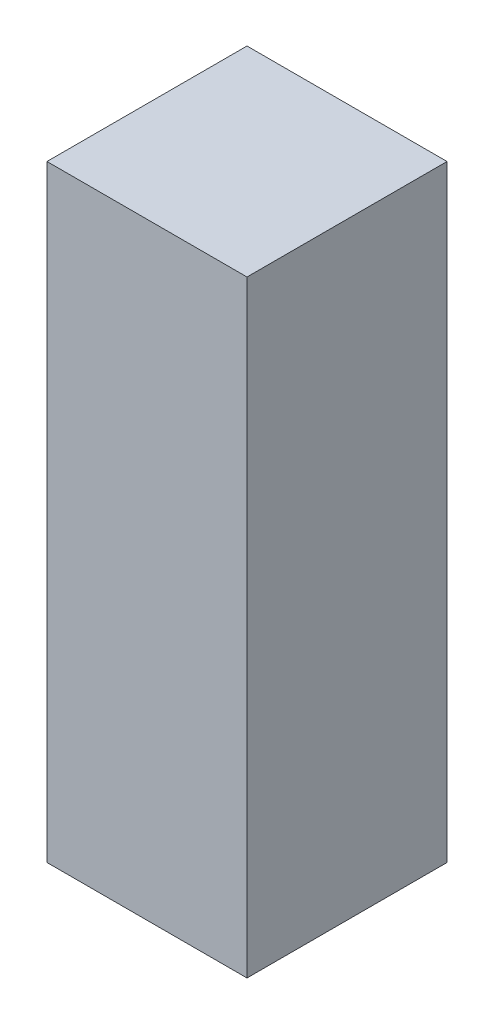
ISO-10303-21;
HEADER;
FILE_DESCRIPTION(('STEP AP214'),'2;1');
FILE_NAME('part.step','',(''),(''),'','','');
FILE_SCHEMA(('AUTOMOTIVE_DESIGN { 1 0 10303 214 1 1 1 1 }'));
ENDSEC;
DATA;
#1=APPLICATION_CONTEXT('core data for automotive mechanical design processes');
#2=APPLICATION_PROTOCOL_DEFINITION('international standard','automotive_design',2000,#1);
#3=PRODUCT_CONTEXT('',#1,'mechanical');
#4=PRODUCT('Part','Part','',(#3));
#5=PRODUCT_RELATED_PRODUCT_CATEGORY('part','',(#4));
#6=PRODUCT_DEFINITION_FORMATION('','',#4);
#7=PRODUCT_DEFINITION_CONTEXT('part definition',#1,'design');
#8=PRODUCT_DEFINITION('design','',#6,#7);
#9=PRODUCT_DEFINITION_SHAPE('','',#8);
#10=(LENGTH_UNIT() NAMED_UNIT(*) SI_UNIT(.MILLI.,.METRE.));
#11=(NAMED_UNIT(*) PLANE_ANGLE_UNIT() SI_UNIT($,.RADIAN.));
#12=(NAMED_UNIT(*) SI_UNIT($,.STERADIAN.) SOLID_ANGLE_UNIT());
#13=UNCERTAINTY_MEASURE_WITH_UNIT(LENGTH_MEASURE(1.E-05),#10,'distance_accuracy_value','');
#14=(GEOMETRIC_REPRESENTATION_CONTEXT(3) GLOBAL_UNCERTAINTY_ASSIGNED_CONTEXT((#13)) GLOBAL_UNIT_ASSIGNED_CONTEXT((#10,
#11,#12)) REPRESENTATION_CONTEXT('',''));
#15=CARTESIAN_POINT('',(0.,0.,0.));
#16=DIRECTION('',(0.,0.,1.));
#17=DIRECTION('',(1.,0.,0.));
#18=AXIS2_PLACEMENT_3D('',#15,#16,#17);
#19=CARTESIAN_POINT('',(50.,303.5,50.));
#20=DIRECTION('',(-1.,0.,0.));
#21=DIRECTION('',(0.,0.,1.));
#22=AXIS2_PLACEMENT_3D('',#19,#20,#21);
#23=PLANE('',#22);
#24=DIRECTION('',(0.,0.,-1.));
#25=VECTOR('',#24,1.);
#26=CARTESIAN_POINT('',(50.,0.,50.));
#27=LINE('',#26,#25);
#28=CARTESIAN_POINT('',(50.,0.,50.));
#29=VERTEX_POINT('',#28);
#30=CARTESIAN_POINT('',(50.,0.,-50.));
#31=VERTEX_POINT('',#30);
#32=EDGE_CURVE('E107',#29,#31,#27,.T.);
#33=ORIENTED_EDGE('',*,*,#32,.T.);
#34=DIRECTION('',(0.,-1.,0.));
#35=VECTOR('',#34,1.);
#36=CARTESIAN_POINT('',(50.,303.5,-50.));
#37=LINE('',#36,#35);
#38=CARTESIAN_POINT('',(50.,303.5,-50.));
#39=VERTEX_POINT('',#38);
#40=EDGE_CURVE('E11',#39,#31,#37,.T.);
#41=ORIENTED_EDGE('',*,*,#40,.F.);
#42=DIRECTION('',(0.,0.,-1.));
#43=VECTOR('',#42,1.);
#44=CARTESIAN_POINT('',(50.,303.5,50.));
#45=LINE('',#44,#43);
#46=CARTESIAN_POINT('',(50.,303.5,50.));
#47=VERTEX_POINT('',#46);
#48=EDGE_CURVE('E91',#47,#39,#45,.T.);
#49=ORIENTED_EDGE('',*,*,#48,.F.);
#50=DIRECTION('',(0.,-1.,0.));
#51=VECTOR('',#50,1.);
#52=CARTESIAN_POINT('',(50.,303.5,50.));
#53=LINE('',#52,#51);
#54=EDGE_CURVE('E103',#47,#29,#53,.T.);
#55=ORIENTED_EDGE('',*,*,#54,.T.);
#56=EDGE_LOOP('',(#33,#41,#49,#55));
#57=FACE_BOUND('',#56,.T.);
#58=ADVANCED_FACE('F39',(#57),#23,.F.);
#59=CARTESIAN_POINT('',(-50.,303.5,-50.));
#60=DIRECTION('',(0.,0.,1.));
#61=DIRECTION('',(1.,0.,0.));
#62=AXIS2_PLACEMENT_3D('',#59,#60,#61);
#63=PLANE('',#62);
#64=DIRECTION('',(-1.,0.,0.));
#65=VECTOR('',#64,1.);
#66=CARTESIAN_POINT('',(-50.,0.,-50.));
#67=LINE('',#66,#65);
#68=CARTESIAN_POINT('',(-50.,0.,-50.));
#69=VERTEX_POINT('',#68);
#70=EDGE_CURVE('E96',#31,#69,#67,.T.);
#71=ORIENTED_EDGE('',*,*,#70,.T.);
#72=DIRECTION('',(0.,-1.,0.));
#73=VECTOR('',#72,1.);
#74=CARTESIAN_POINT('',(-50.,303.5,-50.));
#75=LINE('',#74,#73);
#76=CARTESIAN_POINT('',(-50.,303.5,-50.));
#77=VERTEX_POINT('',#76);
#78=EDGE_CURVE('E48',#77,#69,#75,.T.);
#79=ORIENTED_EDGE('',*,*,#78,.F.);
#80=DIRECTION('',(-1.,0.,0.));
#81=VECTOR('',#80,1.);
#82=CARTESIAN_POINT('',(-50.,303.5,-50.));
#83=LINE('',#82,#81);
#84=EDGE_CURVE('E86',#39,#77,#83,.T.);
#85=ORIENTED_EDGE('',*,*,#84,.F.);
#86=ORIENTED_EDGE('',*,*,#40,.T.);
#87=EDGE_LOOP('',(#71,#79,#85,#86));
#88=FACE_BOUND('',#87,.T.);
#89=ADVANCED_FACE('F95',(#88),#63,.F.);
#90=CARTESIAN_POINT('',(-50.,303.5,50.));
#91=DIRECTION('',(1.,0.,0.));
#92=DIRECTION('',(0.,0.,-1.));
#93=AXIS2_PLACEMENT_3D('',#90,#91,#92);
#94=PLANE('',#93);
#95=DIRECTION('',(0.,0.,1.));
#96=VECTOR('',#95,1.);
#97=CARTESIAN_POINT('',(-50.,0.,50.));
#98=LINE('',#97,#96);
#99=CARTESIAN_POINT('',(-50.,0.,50.));
#100=VERTEX_POINT('',#99);
#101=EDGE_CURVE('E73',#69,#100,#98,.T.);
#102=ORIENTED_EDGE('',*,*,#101,.T.);
#103=DIRECTION('',(0.,-1.,0.));
#104=VECTOR('',#103,1.);
#105=CARTESIAN_POINT('',(-50.,303.5,50.));
#106=LINE('',#105,#104);
#107=CARTESIAN_POINT('',(-50.,303.5,50.));
#108=VERTEX_POINT('',#107);
#109=EDGE_CURVE('E98',#108,#100,#106,.T.);
#110=ORIENTED_EDGE('',*,*,#109,.F.);
#111=DIRECTION('',(0.,0.,1.));
#112=VECTOR('',#111,1.);
#113=CARTESIAN_POINT('',(-50.,303.5,50.));
#114=LINE('',#113,#112);
#115=EDGE_CURVE('E89',#77,#108,#114,.T.);
#116=ORIENTED_EDGE('',*,*,#115,.F.);
#117=ORIENTED_EDGE('',*,*,#78,.T.);
#118=EDGE_LOOP('',(#102,#110,#116,#117));
#119=FACE_BOUND('',#118,.T.);
#120=ADVANCED_FACE('F99',(#119),#94,.F.);
#121=CARTESIAN_POINT('',(-50.,303.5,50.));
#122=DIRECTION('',(0.,0.,-1.));
#123=DIRECTION('',(-1.,0.,0.));
#124=AXIS2_PLACEMENT_3D('',#121,#122,#123);
#125=PLANE('',#124);
#126=DIRECTION('',(1.,0.,0.));
#127=VECTOR('',#126,1.);
#128=CARTESIAN_POINT('',(-50.,0.,50.));
#129=LINE('',#128,#127);
#130=EDGE_CURVE('E79',#100,#29,#129,.T.);
#131=ORIENTED_EDGE('',*,*,#130,.T.);
#132=ORIENTED_EDGE('',*,*,#54,.F.);
#133=DIRECTION('',(1.,0.,0.));
#134=VECTOR('',#133,1.);
#135=CARTESIAN_POINT('',(-50.,303.5,50.));
#136=LINE('',#135,#134);
#137=EDGE_CURVE('E56',#108,#47,#136,.T.);
#138=ORIENTED_EDGE('',*,*,#137,.F.);
#139=ORIENTED_EDGE('',*,*,#109,.T.);
#140=EDGE_LOOP('',(#131,#132,#138,#139));
#141=FACE_BOUND('',#140,.T.);
#142=ADVANCED_FACE('F120',(#141),#125,.F.);
#143=CARTESIAN_POINT('',(0.,303.5,0.));
#144=DIRECTION('',(0.,-1.,0.));
#145=DIRECTION('',(0.,0.,-1.));
#146=AXIS2_PLACEMENT_3D('',#143,#144,#145);
#147=PLANE('',#146);
#148=ORIENTED_EDGE('',*,*,#48,.T.);
#149=ORIENTED_EDGE('',*,*,#84,.T.);
#150=ORIENTED_EDGE('',*,*,#115,.T.);
#151=ORIENTED_EDGE('',*,*,#137,.T.);
#152=EDGE_LOOP('',(#148,#149,#150,#151));
#153=FACE_BOUND('',#152,.T.);
#154=ADVANCED_FACE('F87',(#153),#147,.F.);
#155=CARTESIAN_POINT('',(0.,0.,0.));
#156=DIRECTION('',(0.,-1.,0.));
#157=DIRECTION('',(0.,0.,-1.));
#158=AXIS2_PLACEMENT_3D('',#155,#156,#157);
#159=PLANE('',#158);
#160=ORIENTED_EDGE('',*,*,#32,.F.);
#161=ORIENTED_EDGE('',*,*,#130,.F.);
#162=ORIENTED_EDGE('',*,*,#101,.F.);
#163=ORIENTED_EDGE('',*,*,#70,.F.);
#164=EDGE_LOOP('',(#160,#161,#162,#163));
#165=FACE_BOUND('',#164,.T.);
#166=ADVANCED_FACE('F123',(#165),#159,.T.);
#167=CLOSED_SHELL('',(#58,#89,#120,#142,#154,#166));
#168=MANIFOLD_SOLID_BREP('B2',#167);
#169=ADVANCED_BREP_SHAPE_REPRESENTATION('',(#18,#168),#14);
#170=SHAPE_DEFINITION_REPRESENTATION(#9,#169);
ENDSEC;
END-ISO-10303-21;
